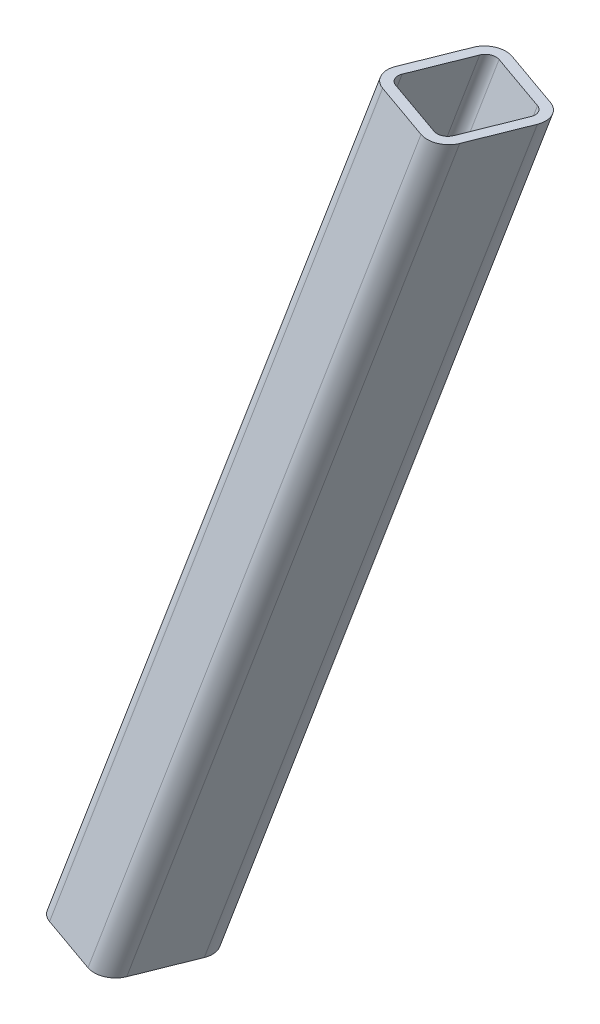
ISO-10303-21;
HEADER;
FILE_DESCRIPTION(('STEP AP214'),'2;1');
FILE_NAME('part.step','',(''),(''),'','','');
FILE_SCHEMA(('AUTOMOTIVE_DESIGN { 1 0 10303 214 1 1 1 1 }'));
ENDSEC;
DATA;
#1=APPLICATION_CONTEXT('core data for automotive mechanical design processes');
#2=APPLICATION_PROTOCOL_DEFINITION('international standard','automotive_design',2000,#1);
#3=PRODUCT_CONTEXT('',#1,'mechanical');
#4=PRODUCT('Part','Part','',(#3));
#5=PRODUCT_RELATED_PRODUCT_CATEGORY('part','',(#4));
#6=PRODUCT_DEFINITION_FORMATION('','',#4);
#7=PRODUCT_DEFINITION_CONTEXT('part definition',#1,'design');
#8=PRODUCT_DEFINITION('design','',#6,#7);
#9=PRODUCT_DEFINITION_SHAPE('','',#8);
#10=(LENGTH_UNIT() NAMED_UNIT(*) SI_UNIT(.MILLI.,.METRE.));
#11=(NAMED_UNIT(*) PLANE_ANGLE_UNIT() SI_UNIT($,.RADIAN.));
#12=(NAMED_UNIT(*) SI_UNIT($,.STERADIAN.) SOLID_ANGLE_UNIT());
#13=UNCERTAINTY_MEASURE_WITH_UNIT(LENGTH_MEASURE(1.E-05),#10,'distance_accuracy_value','');
#14=(GEOMETRIC_REPRESENTATION_CONTEXT(3) GLOBAL_UNCERTAINTY_ASSIGNED_CONTEXT((#13)) GLOBAL_UNIT_ASSIGNED_CONTEXT((#10,
#11,#12)) REPRESENTATION_CONTEXT('',''));
#15=CARTESIAN_POINT('',(0.,0.,0.));
#16=DIRECTION('',(0.,0.,1.));
#17=DIRECTION('',(1.,0.,0.));
#18=AXIS2_PLACEMENT_3D('',#15,#16,#17);
#19=CARTESIAN_POINT('',(-225.,190.,1294.));
#20=DIRECTION('',(0.,1.,0.));
#21=DIRECTION('',(0.,0.,1.));
#22=AXIS2_PLACEMENT_3D('',#19,#20,#21);
#23=PLANE('',#22);
#24=DIRECTION('',(-0.371790918758376,0.,0.928316493836452));
#25=VECTOR('',#24,1.);
#26=CARTESIAN_POINT('',(205.749211024616,190.,1315.9195659938));
#27=LINE('',#26,#25);
#28=CARTESIAN_POINT('',(215.5,190.,1291.57303740188));
#29=VERTEX_POINT('',#28);
#30=CARTESIAN_POINT('',(211.,190.,1302.80898753271));
#31=VERTEX_POINT('',#30);
#32=EDGE_CURVE('E229',#29,#31,#27,.T.);
#33=ORIENTED_EDGE('',*,*,#32,.F.);
#34=CARTESIAN_POINT('',(217.5,190.,1292.27528428506));
#35=DIRECTION('',(0.,1.,0.));
#36=DIRECTION('',(1.,0.,0.));
#37=AXIS2_PLACEMENT_3D('',#34,#35,#36);
#38=ELLIPSE('',#37,2.13600093632938,2.);
#39=CARTESIAN_POINT('',(218.25,190.,1290.40262592992));
#40=VERTEX_POINT('',#39);
#41=EDGE_CURVE('E232',#40,#29,#38,.T.);
#42=ORIENTED_EDGE('',*,*,#41,.F.);
#43=DIRECTION('',(-0.943527372384619,0.,-0.33129457822454));
#44=VECTOR('',#43,1.);
#45=CARTESIAN_POINT('',(155.149390243902,190.,1268.24652266603));
#46=LINE('',#45,#44);
#47=CARTESIAN_POINT('',(230.249999999999,190.,1294.61610722898));
#48=VERTEX_POINT('',#47);
#49=EDGE_CURVE('E235',#48,#40,#46,.T.);
#50=ORIENTED_EDGE('',*,*,#49,.F.);
#51=CARTESIAN_POINT('',(229.5,190.,1296.48876558412));
#52=DIRECTION('',(0.,1.,0.));
#53=DIRECTION('',(1.,0.,0.));
#54=AXIS2_PLACEMENT_3D('',#51,#52,#53);
#55=ELLIPSE('',#54,2.13600093632938,2.);
#56=CARTESIAN_POINT('',(231.5,190.,1297.19101246729));
#57=VERTEX_POINT('',#56);
#58=EDGE_CURVE('E238',#57,#48,#55,.T.);
#59=ORIENTED_EDGE('',*,*,#58,.F.);
#60=DIRECTION('',(0.371790918758376,0.,-0.928316493836452));
#61=VECTOR('',#60,1.);
#62=CARTESIAN_POINT('',(217.053229539238,190.,1333.26283301144));
#63=LINE('',#62,#61);
#64=CARTESIAN_POINT('',(227.,190.,1308.42696259812));
#65=VERTEX_POINT('',#64);
#66=EDGE_CURVE('E241',#65,#57,#63,.T.);
#67=ORIENTED_EDGE('',*,*,#66,.F.);
#68=CARTESIAN_POINT('',(225.,190.,1307.72471571494));
#69=DIRECTION('',(0.,1.,0.));
#70=DIRECTION('',(1.,0.,0.));
#71=AXIS2_PLACEMENT_3D('',#68,#69,#70);
#72=ELLIPSE('',#71,2.13600093632938,2.);
#73=CARTESIAN_POINT('',(224.25,190.,1309.59737407008));
#74=VERTEX_POINT('',#73);
#75=EDGE_CURVE('E244',#74,#65,#72,.T.);
#76=ORIENTED_EDGE('',*,*,#75,.F.);
#77=DIRECTION('',(0.943527372384619,0.,0.33129457822454));
#78=VECTOR('',#77,1.);
#79=CARTESIAN_POINT('',(160.490853658536,190.,1287.21004317393));
#80=LINE('',#79,#78);
#81=CARTESIAN_POINT('',(212.25,190.,1305.38389277102));
#82=VERTEX_POINT('',#81);
#83=EDGE_CURVE('E247',#82,#74,#80,.T.);
#84=ORIENTED_EDGE('',*,*,#83,.F.);
#85=CARTESIAN_POINT('',(213.,190.,1303.51123441588));
#86=DIRECTION('',(0.,1.,0.));
#87=DIRECTION('',(1.,0.,0.));
#88=AXIS2_PLACEMENT_3D('',#85,#86,#87);
#89=ELLIPSE('',#88,2.13600093632938,2.);
#90=EDGE_CURVE('E250',#31,#82,#89,.T.);
#91=ORIENTED_EDGE('',*,*,#90,.F.);
#92=EDGE_LOOP('',(#33,#42,#50,#59,#67,#76,#84,#91));
#93=FACE_BOUND('',#92,.T.);
#94=DIRECTION('',(0.943527372384619,0.,0.33129457822454));
#95=VECTOR('',#94,1.);
#96=CARTESIAN_POINT('',(159.823170731707,190.,1289.1116049831));
#97=LINE('',#96,#95);
#98=CARTESIAN_POINT('',(211.5,190.,1307.25655112616));
#99=VERTEX_POINT('',#98);
#100=CARTESIAN_POINT('',(223.5,190.,1311.47003242522));
#101=VERTEX_POINT('',#100);
#102=EDGE_CURVE('E191',#99,#101,#97,.T.);
#103=ORIENTED_EDGE('',*,*,#102,.T.);
#104=CARTESIAN_POINT('',(225.,190.,1307.72471571494));
#105=DIRECTION('',(0.,1.,0.));
#106=DIRECTION('',(1.,0.,0.));
#107=AXIS2_PLACEMENT_3D('',#104,#105,#106);
#108=ELLIPSE('',#107,4.27200187265877,4.);
#109=CARTESIAN_POINT('',(229.,190.,1309.1292094813));
#110=VERTEX_POINT('',#109);
#111=EDGE_CURVE('E213',#101,#110,#108,.T.);
#112=ORIENTED_EDGE('',*,*,#111,.T.);
#113=DIRECTION('',(0.371790918758376,0.,-0.928316493836452));
#114=VECTOR('',#113,1.);
#115=CARTESIAN_POINT('',(219.019145802651,190.,1334.05018282007));
#116=LINE('',#115,#114);
#117=CARTESIAN_POINT('',(233.5,190.,1297.89325935047));
#118=VERTEX_POINT('',#117);
#119=EDGE_CURVE('E47',#110,#118,#116,.T.);
#120=ORIENTED_EDGE('',*,*,#119,.T.);
#121=CARTESIAN_POINT('',(229.5,190.,1296.48876558412));
#122=DIRECTION('',(0.,1.,0.));
#123=DIRECTION('',(1.,0.,0.));
#124=AXIS2_PLACEMENT_3D('',#121,#122,#123);
#125=ELLIPSE('',#124,4.27200187265877,4.);
#126=CARTESIAN_POINT('',(231.,190.,1292.74344887384));
#127=VERTEX_POINT('',#126);
#128=EDGE_CURVE('E211',#118,#127,#125,.T.);
#129=ORIENTED_EDGE('',*,*,#128,.T.);
#130=DIRECTION('',(-0.943527372384619,0.,-0.33129457822454));
#131=VECTOR('',#130,1.);
#132=CARTESIAN_POINT('',(155.817073170731,190.,1266.34496085686));
#133=LINE('',#132,#131);
#134=CARTESIAN_POINT('',(219.,190.,1288.52996757478));
#135=VERTEX_POINT('',#134);
#136=EDGE_CURVE('E219',#127,#135,#133,.T.);
#137=ORIENTED_EDGE('',*,*,#136,.T.);
#138=CARTESIAN_POINT('',(217.5,190.,1292.27528428506));
#139=DIRECTION('',(0.,1.,0.));
#140=DIRECTION('',(1.,0.,0.));
#141=AXIS2_PLACEMENT_3D('',#138,#139,#140);
#142=ELLIPSE('',#141,4.27200187265877,4.);
#143=CARTESIAN_POINT('',(213.5,190.,1290.8707905187));
#144=VERTEX_POINT('',#143);
#145=EDGE_CURVE('E173',#135,#144,#142,.T.);
#146=ORIENTED_EDGE('',*,*,#145,.T.);
#147=DIRECTION('',(-0.371790918758376,0.,0.928316493836452));
#148=VECTOR('',#147,1.);
#149=CARTESIAN_POINT('',(203.783294761203,190.,1315.13221618516));
#150=LINE('',#149,#148);
#151=CARTESIAN_POINT('',(209.,190.,1302.10674064953));
#152=VERTEX_POINT('',#151);
#153=EDGE_CURVE('E254',#144,#152,#150,.T.);
#154=ORIENTED_EDGE('',*,*,#153,.T.);
#155=CARTESIAN_POINT('',(213.,190.,1303.51123441588));
#156=DIRECTION('',(0.,1.,0.));
#157=DIRECTION('',(1.,0.,0.));
#158=AXIS2_PLACEMENT_3D('',#155,#156,#157);
#159=ELLIPSE('',#158,4.27200187265877,4.);
#160=EDGE_CURVE('E257',#152,#99,#159,.T.);
#161=ORIENTED_EDGE('',*,*,#160,.T.);
#162=EDGE_LOOP('',(#103,#112,#120,#129,#137,#146,#154,#161));
#163=FACE_BOUND('',#162,.T.);
#164=ADVANCED_FACE('F39',(#93,#163),#23,.T.);
#165=CARTESIAN_POINT('',(143.205479452055,2.54794520547946,1290.8707905187));
#166=DIRECTION('',(0.876712328767123,-0.328767123287671,0.351123441588392));
#167=DIRECTION('',(0.371790918758376,0.,-0.928316493836452));
#168=AXIS2_PLACEMENT_3D('',#165,#166,#167);
#169=PLANE('',#168);
#170=DIRECTION('',(0.371790918758376,0.,-0.928316493836452));
#171=VECTOR('',#170,1.);
#172=CARTESIAN_POINT('',(145.613717652009,10.,1291.83529034058));
#173=LINE('',#172,#171);
#174=CARTESIAN_POINT('',(141.5,10.,1302.10674064953));
#175=VERTEX_POINT('',#174);
#176=CARTESIAN_POINT('',(146.,10.,1290.8707905187));
#177=VERTEX_POINT('',#176);
#178=EDGE_CURVE('E154',#175,#177,#173,.T.);
#179=ORIENTED_EDGE('',*,*,#178,.F.);
#180=DIRECTION('',(0.351123441588392,0.936329177569044,0.));
#181=VECTOR('',#180,1.);
#182=CARTESIAN_POINT('',(139.260273972603,4.02739726027396,1302.10674064953));
#183=LINE('',#182,#181);
#184=EDGE_CURVE('E176',#175,#152,#183,.T.);
#185=ORIENTED_EDGE('',*,*,#184,.T.);
#186=ORIENTED_EDGE('',*,*,#153,.F.);
#187=DIRECTION('',(0.351123441588392,0.936329177569044,0.));
#188=VECTOR('',#187,1.);
#189=CARTESIAN_POINT('',(143.205479452055,2.54794520547946,1290.8707905187));
#190=LINE('',#189,#188);
#191=EDGE_CURVE('E174',#177,#144,#190,.T.);
#192=ORIENTED_EDGE('',*,*,#191,.F.);
#193=EDGE_LOOP('',(#179,#185,#186,#192));
#194=FACE_BOUND('',#193,.T.);
#195=ADVANCED_FACE('F330',(#194),#169,.F.);
#196=CARTESIAN_POINT('',(142.767123287671,2.7123287671233,1303.51123441588));
#197=DIRECTION('',(0.351123441588392,0.936329177569044,0.));
#198=DIRECTION('',(-0.936329177569045,0.351123441588392,0.));
#199=AXIS2_PLACEMENT_3D('',#196,#197,#198);
#200=CYLINDRICAL_SURFACE('',#199,4.);
#201=CARTESIAN_POINT('',(145.5,10.,1303.51123441588));
#202=DIRECTION('',(0.,-1.,0.));
#203=DIRECTION('',(1.,0.,0.));
#204=AXIS2_PLACEMENT_3D('',#201,#202,#203);
#205=ELLIPSE('',#204,4.27200187265877,4.);
#206=CARTESIAN_POINT('',(144.,10.,1307.25655112616));
#207=VERTEX_POINT('',#206);
#208=EDGE_CURVE('E268',#207,#175,#205,.T.);
#209=ORIENTED_EDGE('',*,*,#208,.F.);
#210=DIRECTION('',(0.351123441588392,0.936329177569044,0.));
#211=VECTOR('',#210,1.);
#212=CARTESIAN_POINT('',(141.45205479452,3.20547945205485,1307.25655112616));
#213=LINE('',#212,#211);
#214=EDGE_CURVE('E183',#207,#99,#213,.T.);
#215=ORIENTED_EDGE('',*,*,#214,.T.);
#216=ORIENTED_EDGE('',*,*,#160,.F.);
#217=ORIENTED_EDGE('',*,*,#184,.F.);
#218=EDGE_LOOP('',(#209,#215,#216,#217));
#219=FACE_BOUND('',#218,.T.);
#220=ADVANCED_FACE('F335',(#219),#200,.T.);
#221=CARTESIAN_POINT('',(156.794520547945,-2.54794520547946,1309.1292094813));
#222=DIRECTION('',(-0.876712328767123,0.328767123287671,-0.351123441588392));
#223=DIRECTION('',(-0.371790918758376,0.,0.928316493836452));
#224=AXIS2_PLACEMENT_3D('',#221,#222,#223);
#225=PLANE('',#224);
#226=DIRECTION('',(-0.371790918758376,0.,0.928316493836452));
#227=VECTOR('',#226,1.);
#228=CARTESIAN_POINT('',(160.849568693457,10.,1310.75325697549));
#229=LINE('',#228,#227);
#230=CARTESIAN_POINT('',(166.,10.,1297.89325935047));
#231=VERTEX_POINT('',#230);
#232=CARTESIAN_POINT('',(161.5,10.,1309.1292094813));
#233=VERTEX_POINT('',#232);
#234=EDGE_CURVE('E263',#231,#233,#229,.T.);
#235=ORIENTED_EDGE('',*,*,#234,.F.);
#236=DIRECTION('',(0.351123441588392,0.936329177569044,0.));
#237=VECTOR('',#236,1.);
#238=CARTESIAN_POINT('',(160.739726027397,-4.02739726027396,1297.89325935047));
#239=LINE('',#238,#237);
#240=EDGE_CURVE('E178',#231,#118,#239,.T.);
#241=ORIENTED_EDGE('',*,*,#240,.T.);
#242=ORIENTED_EDGE('',*,*,#119,.F.);
#243=DIRECTION('',(0.351123441588392,0.936329177569044,0.));
#244=VECTOR('',#243,1.);
#245=CARTESIAN_POINT('',(156.794520547945,-2.54794520547946,1309.1292094813));
#246=LINE('',#245,#244);
#247=EDGE_CURVE('E204',#233,#110,#246,.T.);
#248=ORIENTED_EDGE('',*,*,#247,.F.);
#249=EDGE_LOOP('',(#235,#241,#242,#248));
#250=FACE_BOUND('',#249,.T.);
#251=ADVANCED_FACE('F262',(#250),#225,.F.);
#252=CARTESIAN_POINT('',(157.232876712329,-2.71232876712324,1296.48876558412));
#253=DIRECTION('',(0.351123441588392,0.936329177569044,0.));
#254=DIRECTION('',(-0.936329177569045,0.351123441588392,0.));
#255=AXIS2_PLACEMENT_3D('',#252,#253,#254);
#256=CYLINDRICAL_SURFACE('',#255,4.);
#257=CARTESIAN_POINT('',(162.,10.,1296.48876558412));
#258=DIRECTION('',(0.,-1.,0.));
#259=DIRECTION('',(1.,0.,0.));
#260=AXIS2_PLACEMENT_3D('',#257,#258,#259);
#261=ELLIPSE('',#260,4.27200187265877,4.);
#262=CARTESIAN_POINT('',(163.5,10.,1292.74344887384));
#263=VERTEX_POINT('',#262);
#264=EDGE_CURVE('E168',#263,#231,#261,.T.);
#265=ORIENTED_EDGE('',*,*,#264,.F.);
#266=DIRECTION('',(0.351123441588392,0.936329177569044,0.));
#267=VECTOR('',#266,1.);
#268=CARTESIAN_POINT('',(158.547945205479,-3.20547945205474,1292.74344887384));
#269=LINE('',#268,#267);
#270=EDGE_CURVE('E166',#263,#127,#269,.T.);
#271=ORIENTED_EDGE('',*,*,#270,.T.);
#272=ORIENTED_EDGE('',*,*,#128,.F.);
#273=ORIENTED_EDGE('',*,*,#240,.F.);
#274=EDGE_LOOP('',(#265,#271,#272,#273));
#275=FACE_BOUND('',#274,.T.);
#276=ADVANCED_FACE('F218',(#275),#256,.T.);
#277=CARTESIAN_POINT('',(142.767123287671,2.7123287671233,1303.51123441588));
#278=DIRECTION('',(0.351123441588392,0.936329177569044,0.));
#279=DIRECTION('',(-0.936329177569045,0.351123441588392,0.));
#280=AXIS2_PLACEMENT_3D('',#277,#278,#279);
#281=CYLINDRICAL_SURFACE('',#280,2.);
#282=DIRECTION('',(0.351123441588392,0.936329177569044,0.));
#283=VECTOR('',#282,1.);
#284=CARTESIAN_POINT('',(142.109589041096,2.9589041095891,1305.38389277102));
#285=LINE('',#284,#283);
#286=CARTESIAN_POINT('',(144.75,10.,1305.38389277102));
#287=VERTEX_POINT('',#286);
#288=EDGE_CURVE('E203',#287,#82,#285,.T.);
#289=ORIENTED_EDGE('',*,*,#288,.F.);
#290=CARTESIAN_POINT('',(145.5,10.,1303.51123441588));
#291=DIRECTION('',(0.,-1.,0.));
#292=DIRECTION('',(1.,0.,0.));
#293=AXIS2_PLACEMENT_3D('',#290,#291,#292);
#294=ELLIPSE('',#293,2.13600093632938,2.);
#295=CARTESIAN_POINT('',(143.5,10.,1302.80898753271));
#296=VERTEX_POINT('',#295);
#297=EDGE_CURVE('E220',#287,#296,#294,.T.);
#298=ORIENTED_EDGE('',*,*,#297,.T.);
#299=DIRECTION('',(0.351123441588392,0.936329177569044,0.));
#300=VECTOR('',#299,1.);
#301=CARTESIAN_POINT('',(141.013698630137,3.36986301369863,1302.80898753271));
#302=LINE('',#301,#300);
#303=EDGE_CURVE('E188',#296,#31,#302,.T.);
#304=ORIENTED_EDGE('',*,*,#303,.T.);
#305=ORIENTED_EDGE('',*,*,#90,.T.);
#306=EDGE_LOOP('',(#289,#298,#304,#305));
#307=FACE_BOUND('',#306,.T.);
#308=ADVANCED_FACE('F41',(#307),#281,.F.);
#309=CARTESIAN_POINT('',(144.958904109589,1.89041095890413,1291.57303740188));
#310=DIRECTION('',(0.876712328767123,-0.328767123287671,0.351123441588392));
#311=DIRECTION('',(0.371790918758376,0.,-0.928316493836452));
#312=AXIS2_PLACEMENT_3D('',#309,#310,#311);
#313=PLANE('',#312);
#314=ORIENTED_EDGE('',*,*,#303,.F.);
#315=DIRECTION('',(0.371790918758376,0.,-0.928316493836452));
#316=VECTOR('',#315,1.);
#317=CARTESIAN_POINT('',(147.579633915422,10.,1292.62264014921));
#318=LINE('',#317,#316);
#319=CARTESIAN_POINT('',(148.,9.99999999999999,1291.57303740188));
#320=VERTEX_POINT('',#319);
#321=EDGE_CURVE('E158',#296,#320,#318,.T.);
#322=ORIENTED_EDGE('',*,*,#321,.T.);
#323=DIRECTION('',(0.351123441588392,0.936329177569044,0.));
#324=VECTOR('',#323,1.);
#325=CARTESIAN_POINT('',(144.958904109589,1.89041095890413,1291.57303740188));
#326=LINE('',#325,#324);
#327=EDGE_CURVE('E190',#320,#29,#326,.T.);
#328=ORIENTED_EDGE('',*,*,#327,.T.);
#329=ORIENTED_EDGE('',*,*,#32,.T.);
#330=EDGE_LOOP('',(#314,#322,#328,#329));
#331=FACE_BOUND('',#330,.T.);
#332=ADVANCED_FACE('F298',(#331),#313,.T.);
#333=CARTESIAN_POINT('',(146.712328767123,1.2328767123288,1292.27528428506));
#334=DIRECTION('',(0.351123441588392,0.936329177569044,0.));
#335=DIRECTION('',(-0.936329177569045,0.351123441588392,0.));
#336=AXIS2_PLACEMENT_3D('',#333,#334,#335);
#337=CYLINDRICAL_SURFACE('',#336,2.);
#338=ORIENTED_EDGE('',*,*,#327,.F.);
#339=CARTESIAN_POINT('',(150.,10.,1292.27528428506));
#340=DIRECTION('',(0.,-1.,0.));
#341=DIRECTION('',(1.,0.,0.));
#342=AXIS2_PLACEMENT_3D('',#339,#340,#341);
#343=ELLIPSE('',#342,2.13600093632938,2.);
#344=CARTESIAN_POINT('',(150.75,10.,1290.40262592992));
#345=VERTEX_POINT('',#344);
#346=EDGE_CURVE('E60',#320,#345,#343,.T.);
#347=ORIENTED_EDGE('',*,*,#346,.T.);
#348=DIRECTION('',(0.351123441588392,0.936329177569044,0.));
#349=VECTOR('',#348,1.);
#350=CARTESIAN_POINT('',(147.369863013698,0.986301369862996,1290.40262592992));
#351=LINE('',#350,#349);
#352=EDGE_CURVE('E193',#345,#40,#351,.T.);
#353=ORIENTED_EDGE('',*,*,#352,.T.);
#354=ORIENTED_EDGE('',*,*,#41,.T.);
#355=EDGE_LOOP('',(#338,#347,#353,#354));
#356=FACE_BOUND('',#355,.T.);
#357=ADVANCED_FACE('F301',(#356),#337,.F.);
#358=CARTESIAN_POINT('',(147.369863013698,0.986301369862996,1290.40262592992));
#359=DIRECTION('',(-0.328767123287671,0.123287671232877,0.936329177569045));
#360=DIRECTION('',(0.943527372384619,0.,0.33129457822454));
#361=AXIS2_PLACEMENT_3D('',#358,#359,#360);
#362=PLANE('',#361);
#363=ORIENTED_EDGE('',*,*,#352,.F.);
#364=DIRECTION('',(0.943527372384619,0.,0.33129457822454));
#365=VECTOR('',#364,1.);
#366=CARTESIAN_POINT('',(147.740853658536,10.,1289.34604411026));
#367=LINE('',#366,#365);
#368=CARTESIAN_POINT('',(162.749999999999,10.,1294.61610722898));
#369=VERTEX_POINT('',#368);
#370=EDGE_CURVE('E273',#345,#369,#367,.T.);
#371=ORIENTED_EDGE('',*,*,#370,.T.);
#372=DIRECTION('',(0.351123441588392,0.936329177569044,0.));
#373=VECTOR('',#372,1.);
#374=CARTESIAN_POINT('',(157.890410958904,-2.95890410958899,1294.61610722898));
#375=LINE('',#374,#373);
#376=EDGE_CURVE('E195',#369,#48,#375,.T.);
#377=ORIENTED_EDGE('',*,*,#376,.T.);
#378=ORIENTED_EDGE('',*,*,#49,.T.);
#379=EDGE_LOOP('',(#363,#371,#377,#378));
#380=FACE_BOUND('',#379,.T.);
#381=ADVANCED_FACE('F306',(#380),#362,.T.);
#382=CARTESIAN_POINT('',(157.232876712329,-2.71232876712324,1296.48876558412));
#383=DIRECTION('',(0.351123441588392,0.936329177569044,0.));
#384=DIRECTION('',(-0.936329177569045,0.351123441588392,0.));
#385=AXIS2_PLACEMENT_3D('',#382,#383,#384);
#386=CYLINDRICAL_SURFACE('',#385,2.);
#387=ORIENTED_EDGE('',*,*,#376,.F.);
#388=CARTESIAN_POINT('',(162.,10.,1296.48876558412));
#389=DIRECTION('',(0.,-1.,0.));
#390=DIRECTION('',(1.,0.,0.));
#391=AXIS2_PLACEMENT_3D('',#388,#389,#390);
#392=ELLIPSE('',#391,2.13600093632938,2.);
#393=CARTESIAN_POINT('',(164.,10.,1297.19101246729));
#394=VERTEX_POINT('',#393);
#395=EDGE_CURVE('E276',#369,#394,#392,.T.);
#396=ORIENTED_EDGE('',*,*,#395,.T.);
#397=DIRECTION('',(0.351123441588392,0.936329177569044,0.));
#398=VECTOR('',#397,1.);
#399=CARTESIAN_POINT('',(158.986301369863,-3.36986301369863,1297.19101246729));
#400=LINE('',#399,#398);
#401=EDGE_CURVE('E197',#394,#57,#400,.T.);
#402=ORIENTED_EDGE('',*,*,#401,.T.);
#403=ORIENTED_EDGE('',*,*,#58,.T.);
#404=EDGE_LOOP('',(#387,#396,#402,#403));
#405=FACE_BOUND('',#404,.T.);
#406=ADVANCED_FACE('F309',(#405),#386,.F.);
#407=CARTESIAN_POINT('',(155.041095890411,-1.89041095890413,1308.42696259812));
#408=DIRECTION('',(-0.876712328767123,0.328767123287671,-0.351123441588392));
#409=DIRECTION('',(-0.371790918758376,0.,0.928316493836452));
#410=AXIS2_PLACEMENT_3D('',#407,#408,#409);
#411=PLANE('',#410);
#412=ORIENTED_EDGE('',*,*,#401,.F.);
#413=DIRECTION('',(-0.371790918758376,0.,0.928316493836452));
#414=VECTOR('',#413,1.);
#415=CARTESIAN_POINT('',(158.883652430044,10.,1309.96590716685));
#416=LINE('',#415,#414);
#417=CARTESIAN_POINT('',(159.5,10.,1308.42696259812));
#418=VERTEX_POINT('',#417);
#419=EDGE_CURVE('E279',#394,#418,#416,.T.);
#420=ORIENTED_EDGE('',*,*,#419,.T.);
#421=DIRECTION('',(0.351123441588392,0.936329177569044,0.));
#422=VECTOR('',#421,1.);
#423=CARTESIAN_POINT('',(155.041095890411,-1.89041095890413,1308.42696259812));
#424=LINE('',#423,#422);
#425=EDGE_CURVE('E199',#418,#65,#424,.T.);
#426=ORIENTED_EDGE('',*,*,#425,.T.);
#427=ORIENTED_EDGE('',*,*,#66,.T.);
#428=EDGE_LOOP('',(#412,#420,#426,#427));
#429=FACE_BOUND('',#428,.T.);
#430=ADVANCED_FACE('F313',(#429),#411,.T.);
#431=CARTESIAN_POINT('',(153.287671232877,-1.23287671232875,1307.72471571494));
#432=DIRECTION('',(0.351123441588392,0.936329177569044,0.));
#433=DIRECTION('',(-0.936329177569045,0.351123441588392,0.));
#434=AXIS2_PLACEMENT_3D('',#431,#432,#433);
#435=CYLINDRICAL_SURFACE('',#434,2.);
#436=ORIENTED_EDGE('',*,*,#425,.F.);
#437=CARTESIAN_POINT('',(157.5,10.,1307.72471571494));
#438=DIRECTION('',(0.,-1.,0.));
#439=DIRECTION('',(1.,0.,0.));
#440=AXIS2_PLACEMENT_3D('',#437,#438,#439);
#441=ELLIPSE('',#440,2.13600093632938,2.);
#442=CARTESIAN_POINT('',(156.75,10.,1309.59737407008));
#443=VERTEX_POINT('',#442);
#444=EDGE_CURVE('E282',#418,#443,#441,.T.);
#445=ORIENTED_EDGE('',*,*,#444,.T.);
#446=DIRECTION('',(0.351123441588392,0.936329177569044,0.));
#447=VECTOR('',#446,1.);
#448=CARTESIAN_POINT('',(152.630136986301,-0.986301369862996,1309.59737407008));
#449=LINE('',#448,#447);
#450=EDGE_CURVE('E201',#443,#74,#449,.T.);
#451=ORIENTED_EDGE('',*,*,#450,.T.);
#452=ORIENTED_EDGE('',*,*,#75,.T.);
#453=EDGE_LOOP('',(#436,#445,#451,#452));
#454=FACE_BOUND('',#453,.T.);
#455=ADVANCED_FACE('F316',(#454),#435,.F.);
#456=CARTESIAN_POINT('',(152.630136986301,-0.986301369862996,1309.59737407008));
#457=DIRECTION('',(0.328767123287671,-0.123287671232877,-0.936329177569045));
#458=DIRECTION('',(-0.943527372384619,0.,-0.33129457822454));
#459=AXIS2_PLACEMENT_3D('',#456,#457,#458);
#460=PLANE('',#459);
#461=ORIENTED_EDGE('',*,*,#450,.F.);
#462=DIRECTION('',(-0.943527372384619,0.,-0.33129457822454));
#463=VECTOR('',#462,1.);
#464=CARTESIAN_POINT('',(153.082317073171,10.,1308.30956461816));
#465=LINE('',#464,#463);
#466=EDGE_CURVE('E224',#443,#287,#465,.T.);
#467=ORIENTED_EDGE('',*,*,#466,.T.);
#468=ORIENTED_EDGE('',*,*,#288,.T.);
#469=ORIENTED_EDGE('',*,*,#83,.T.);
#470=EDGE_LOOP('',(#461,#467,#468,#469));
#471=FACE_BOUND('',#470,.T.);
#472=ADVANCED_FACE('F288',(#471),#460,.T.);
#473=CARTESIAN_POINT('',(-150.,10.,1306.));
#474=DIRECTION('',(0.,-1.,0.));
#475=DIRECTION('',(0.,0.,-1.));
#476=AXIS2_PLACEMENT_3D('',#473,#474,#475);
#477=PLANE('',#476);
#478=ORIENTED_EDGE('',*,*,#466,.F.);
#479=ORIENTED_EDGE('',*,*,#444,.F.);
#480=ORIENTED_EDGE('',*,*,#419,.F.);
#481=ORIENTED_EDGE('',*,*,#395,.F.);
#482=ORIENTED_EDGE('',*,*,#370,.F.);
#483=ORIENTED_EDGE('',*,*,#346,.F.);
#484=ORIENTED_EDGE('',*,*,#321,.F.);
#485=ORIENTED_EDGE('',*,*,#297,.F.);
#486=EDGE_LOOP('',(#478,#479,#480,#481,#482,#483,#484,#485));
#487=FACE_BOUND('',#486,.T.);
#488=CARTESIAN_POINT('',(150.,10.,1292.27528428506));
#489=DIRECTION('',(0.,-1.,0.));
#490=DIRECTION('',(1.,0.,0.));
#491=AXIS2_PLACEMENT_3D('',#488,#489,#490);
#492=ELLIPSE('',#491,4.27200187265877,4.);
#493=CARTESIAN_POINT('',(151.5,10.,1288.52996757478));
#494=VERTEX_POINT('',#493);
#495=EDGE_CURVE('E148',#177,#494,#492,.T.);
#496=ORIENTED_EDGE('',*,*,#495,.T.);
#497=DIRECTION('',(0.943527372384619,0.,0.33129457822454));
#498=VECTOR('',#497,1.);
#499=CARTESIAN_POINT('',(148.408536585366,10.,1287.44448230109));
#500=LINE('',#499,#498);
#501=EDGE_CURVE('E151',#494,#263,#500,.T.);
#502=ORIENTED_EDGE('',*,*,#501,.T.);
#503=ORIENTED_EDGE('',*,*,#264,.T.);
#504=ORIENTED_EDGE('',*,*,#234,.T.);
#505=CARTESIAN_POINT('',(157.5,10.,1307.72471571494));
#506=DIRECTION('',(0.,-1.,0.));
#507=DIRECTION('',(1.,0.,0.));
#508=AXIS2_PLACEMENT_3D('',#505,#506,#507);
#509=ELLIPSE('',#508,4.27200187265877,4.);
#510=CARTESIAN_POINT('',(156.,10.,1311.47003242522));
#511=VERTEX_POINT('',#510);
#512=EDGE_CURVE('E11',#233,#511,#509,.T.);
#513=ORIENTED_EDGE('',*,*,#512,.T.);
#514=DIRECTION('',(-0.943527372384619,0.,-0.33129457822454));
#515=VECTOR('',#514,1.);
#516=CARTESIAN_POINT('',(152.414634146341,10.,1310.21112642733));
#517=LINE('',#516,#515);
#518=EDGE_CURVE('E167',#511,#207,#517,.T.);
#519=ORIENTED_EDGE('',*,*,#518,.T.);
#520=ORIENTED_EDGE('',*,*,#208,.T.);
#521=ORIENTED_EDGE('',*,*,#178,.T.);
#522=EDGE_LOOP('',(#496,#502,#503,#504,#513,#519,#520,#521));
#523=FACE_BOUND('',#522,.T.);
#524=ADVANCED_FACE('F150',(#487,#523),#477,.T.);
#525=CARTESIAN_POINT('',(153.287671232877,-1.23287671232875,1307.72471571494));
#526=DIRECTION('',(0.351123441588392,0.936329177569044,0.));
#527=DIRECTION('',(-0.936329177569045,0.351123441588392,0.));
#528=AXIS2_PLACEMENT_3D('',#525,#526,#527);
#529=CYLINDRICAL_SURFACE('',#528,4.);
#530=DIRECTION('',(0.351123441588392,0.936329177569044,0.));
#531=VECTOR('',#530,1.);
#532=CARTESIAN_POINT('',(151.972602739726,-0.739726027397247,1311.47003242522));
#533=LINE('',#532,#531);
#534=EDGE_CURVE('E185',#511,#101,#533,.T.);
#535=ORIENTED_EDGE('',*,*,#534,.F.);
#536=ORIENTED_EDGE('',*,*,#512,.F.);
#537=ORIENTED_EDGE('',*,*,#247,.T.);
#538=ORIENTED_EDGE('',*,*,#111,.F.);
#539=EDGE_LOOP('',(#535,#536,#537,#538));
#540=FACE_BOUND('',#539,.T.);
#541=ADVANCED_FACE('F318',(#540),#529,.T.);
#542=CARTESIAN_POINT('',(151.972602739726,-0.739726027397247,1311.47003242522));
#543=DIRECTION('',(0.328767123287671,-0.123287671232877,-0.936329177569045));
#544=DIRECTION('',(-0.943527372384619,0.,-0.33129457822454));
#545=AXIS2_PLACEMENT_3D('',#542,#543,#544);
#546=PLANE('',#545);
#547=ORIENTED_EDGE('',*,*,#518,.F.);
#548=ORIENTED_EDGE('',*,*,#534,.T.);
#549=ORIENTED_EDGE('',*,*,#102,.F.);
#550=ORIENTED_EDGE('',*,*,#214,.F.);
#551=EDGE_LOOP('',(#547,#548,#549,#550));
#552=FACE_BOUND('',#551,.T.);
#553=ADVANCED_FACE('F324',(#552),#546,.F.);
#554=CARTESIAN_POINT('',(146.712328767123,1.2328767123288,1292.27528428506));
#555=DIRECTION('',(0.351123441588392,0.936329177569044,0.));
#556=DIRECTION('',(-0.936329177569045,0.351123441588392,0.));
#557=AXIS2_PLACEMENT_3D('',#554,#555,#556);
#558=CYLINDRICAL_SURFACE('',#557,4.);
#559=DIRECTION('',(0.351123441588392,0.936329177569044,0.));
#560=VECTOR('',#559,1.);
#561=CARTESIAN_POINT('',(148.027397260274,0.739726027397247,1288.52996757478));
#562=LINE('',#561,#560);
#563=EDGE_CURVE('E165',#494,#135,#562,.T.);
#564=ORIENTED_EDGE('',*,*,#563,.F.);
#565=ORIENTED_EDGE('',*,*,#495,.F.);
#566=ORIENTED_EDGE('',*,*,#191,.T.);
#567=ORIENTED_EDGE('',*,*,#145,.F.);
#568=EDGE_LOOP('',(#564,#565,#566,#567));
#569=FACE_BOUND('',#568,.T.);
#570=ADVANCED_FACE('F171',(#569),#558,.T.);
#571=CARTESIAN_POINT('',(148.027397260274,0.739726027397247,1288.52996757478));
#572=DIRECTION('',(-0.328767123287671,0.123287671232877,0.936329177569045));
#573=DIRECTION('',(0.943527372384619,0.,0.33129457822454));
#574=AXIS2_PLACEMENT_3D('',#571,#572,#573);
#575=PLANE('',#574);
#576=ORIENTED_EDGE('',*,*,#501,.F.);
#577=ORIENTED_EDGE('',*,*,#563,.T.);
#578=ORIENTED_EDGE('',*,*,#136,.F.);
#579=ORIENTED_EDGE('',*,*,#270,.F.);
#580=EDGE_LOOP('',(#576,#577,#578,#579));
#581=FACE_BOUND('',#580,.T.);
#582=ADVANCED_FACE('F163',(#581),#575,.F.);
#583=CLOSED_SHELL('',(#164,#195,#220,#251,#276,#308,#332,#357,#381,#406,#430,#455,#472,#524,
#541,#553,#570,#582));
#584=MANIFOLD_SOLID_BREP('B2',#583);
#585=ADVANCED_BREP_SHAPE_REPRESENTATION('',(#18,#584),#14);
#586=SHAPE_DEFINITION_REPRESENTATION(#9,#585);
ENDSEC;
END-ISO-10303-21;
